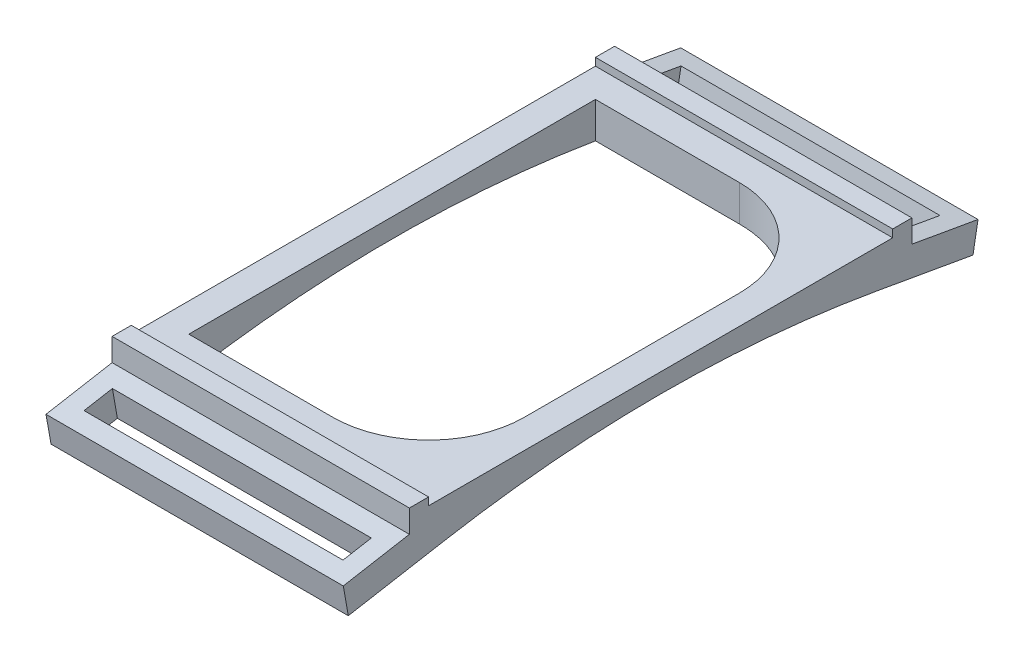
ISO-10303-21;
HEADER;
FILE_DESCRIPTION(('STEP AP214'),'2;1');
FILE_NAME('part.step','',(''),(''),'','','');
FILE_SCHEMA(('AUTOMOTIVE_DESIGN { 1 0 10303 214 1 1 1 1 }'));
ENDSEC;
DATA;
#1=APPLICATION_CONTEXT('core data for automotive mechanical design processes');
#2=APPLICATION_PROTOCOL_DEFINITION('international standard','automotive_design',2000,#1);
#3=PRODUCT_CONTEXT('',#1,'mechanical');
#4=PRODUCT('Part','Part','',(#3));
#5=PRODUCT_RELATED_PRODUCT_CATEGORY('part','',(#4));
#6=PRODUCT_DEFINITION_FORMATION('','',#4);
#7=PRODUCT_DEFINITION_CONTEXT('part definition',#1,'design');
#8=PRODUCT_DEFINITION('design','',#6,#7);
#9=PRODUCT_DEFINITION_SHAPE('','',#8);
#10=(LENGTH_UNIT() NAMED_UNIT(*) SI_UNIT(.MILLI.,.METRE.));
#11=(NAMED_UNIT(*) PLANE_ANGLE_UNIT() SI_UNIT($,.RADIAN.));
#12=(NAMED_UNIT(*) SI_UNIT($,.STERADIAN.) SOLID_ANGLE_UNIT());
#13=UNCERTAINTY_MEASURE_WITH_UNIT(LENGTH_MEASURE(1.E-05),#10,'distance_accuracy_value','');
#14=(GEOMETRIC_REPRESENTATION_CONTEXT(3) GLOBAL_UNCERTAINTY_ASSIGNED_CONTEXT((#13)) GLOBAL_UNIT_ASSIGNED_CONTEXT((#10,
#11,#12)) REPRESENTATION_CONTEXT('',''));
#15=CARTESIAN_POINT('',(0.,0.,0.));
#16=DIRECTION('',(0.,0.,1.));
#17=DIRECTION('',(1.,0.,0.));
#18=AXIS2_PLACEMENT_3D('',#15,#16,#17);
#19=CARTESIAN_POINT('',(31.,-1.57462492229734,26.2));
#20=DIRECTION('',(0.,-0.984807753012208,-0.173648177666928));
#21=DIRECTION('',(0.,0.173648177666928,-0.984807753012209));
#22=AXIS2_PLACEMENT_3D('',#19,#20,#21);
#23=PLANE('',#22);
#24=DIRECTION('',(0.,-0.173648177666928,0.984807753012208));
#25=VECTOR('',#24,1.);
#26=CARTESIAN_POINT('',(0.,-1.57462492229734,26.2));
#27=LINE('',#26,#25);
#28=CARTESIAN_POINT('',(0.,-1.57462492229734,26.2));
#29=VERTEX_POINT('',#28);
#30=CARTESIAN_POINT('',(0.,-2.79016216596584,33.0936542710855));
#31=VERTEX_POINT('',#30);
#32=EDGE_CURVE('E363',#29,#31,#27,.T.);
#33=ORIENTED_EDGE('',*,*,#32,.T.);
#34=DIRECTION('',(-1.,0.,0.));
#35=VECTOR('',#34,1.);
#36=CARTESIAN_POINT('',(31.,-2.79016216596584,33.0936542710855));
#37=LINE('',#36,#35);
#38=CARTESIAN_POINT('',(31.,-2.79016216596584,33.0936542710855));
#39=VERTEX_POINT('',#38);
#40=EDGE_CURVE('E373',#39,#31,#37,.T.);
#41=ORIENTED_EDGE('',*,*,#40,.F.);
#42=DIRECTION('',(0.,-0.173648177666928,0.984807753012208));
#43=VECTOR('',#42,1.);
#44=CARTESIAN_POINT('',(31.,-1.57462492229734,26.2));
#45=LINE('',#44,#43);
#46=CARTESIAN_POINT('',(31.,-1.57462492229734,26.2));
#47=VERTEX_POINT('',#46);
#48=EDGE_CURVE('E334',#47,#39,#45,.T.);
#49=ORIENTED_EDGE('',*,*,#48,.F.);
#50=DIRECTION('',(-1.,0.,0.));
#51=VECTOR('',#50,1.);
#52=CARTESIAN_POINT('',(31.,-1.57462492229734,26.2));
#53=LINE('',#52,#51);
#54=EDGE_CURVE('E376',#47,#29,#53,.T.);
#55=ORIENTED_EDGE('',*,*,#54,.T.);
#56=EDGE_LOOP('',(#33,#41,#49,#55));
#57=FACE_BOUND('',#56,.T.);
#58=DIRECTION('',(-1.,0.,0.));
#59=VECTOR('',#58,1.);
#60=CARTESIAN_POINT('',(29.,-2.44286581063198,31.124038765061));
#61=LINE('',#60,#59);
#62=CARTESIAN_POINT('',(29.,-2.44286581063198,31.124038765061));
#63=VERTEX_POINT('',#62);
#64=CARTESIAN_POINT('',(2.,-2.44286581063198,31.124038765061));
#65=VERTEX_POINT('',#64);
#66=EDGE_CURVE('E256',#63,#65,#61,.T.);
#67=ORIENTED_EDGE('',*,*,#66,.T.);
#68=DIRECTION('',(0.,0.173648177666928,-0.984807753012209));
#69=VECTOR('',#68,1.);
#70=CARTESIAN_POINT('',(2.,-2.44286581063198,31.124038765061));
#71=LINE('',#70,#69);
#72=CARTESIAN_POINT('',(2.,-1.92192127763119,28.1696155060244));
#73=VERTEX_POINT('',#72);
#74=EDGE_CURVE('E265',#65,#73,#71,.T.);
#75=ORIENTED_EDGE('',*,*,#74,.T.);
#76=DIRECTION('',(1.,0.,0.));
#77=VECTOR('',#76,1.);
#78=CARTESIAN_POINT('',(2.,-1.92192127763119,28.1696155060244));
#79=LINE('',#78,#77);
#80=CARTESIAN_POINT('',(29.,-1.92192127763119,28.1696155060244));
#81=VERTEX_POINT('',#80);
#82=EDGE_CURVE('E262',#73,#81,#79,.T.);
#83=ORIENTED_EDGE('',*,*,#82,.T.);
#84=DIRECTION('',(0.,-0.173648177666928,0.984807753012209));
#85=VECTOR('',#84,1.);
#86=CARTESIAN_POINT('',(29.,-1.92192127763119,28.1696155060244));
#87=LINE('',#86,#85);
#88=EDGE_CURVE('E259',#81,#63,#87,.T.);
#89=ORIENTED_EDGE('',*,*,#88,.T.);
#90=EDGE_LOOP('',(#67,#75,#83,#89));
#91=FACE_BOUND('',#90,.T.);
#92=ADVANCED_FACE('F33',(#57,#91),#23,.F.);
#93=CARTESIAN_POINT('',(31.,-5.74458542500246,32.5727097380847));
#94=DIRECTION('',(0.,0.984807753012209,0.173648177666928));
#95=DIRECTION('',(0.,-0.173648177666928,0.984807753012209));
#96=AXIS2_PLACEMENT_3D('',#93,#94,#95);
#97=PLANE('',#96);
#98=DIRECTION('',(0.,0.173648177666928,-0.984807753012208));
#99=VECTOR('',#98,1.);
#100=CARTESIAN_POINT('',(0.,-5.74458542500246,32.5727097380847));
#101=LINE('',#100,#99);
#102=CARTESIAN_POINT('',(0.,-5.74458542500246,32.5727097380847));
#103=VERTEX_POINT('',#102);
#104=CARTESIAN_POINT('',(0.,-3.96849492933327,22.5));
#105=VERTEX_POINT('',#104);
#106=EDGE_CURVE('E314',#103,#105,#101,.T.);
#107=ORIENTED_EDGE('',*,*,#106,.T.);
#108=DIRECTION('',(-1.,0.,0.));
#109=VECTOR('',#108,1.);
#110=CARTESIAN_POINT('',(31.,-3.96849492933327,22.5));
#111=LINE('',#110,#109);
#112=CARTESIAN_POINT('',(31.,-3.96849492933327,22.5));
#113=VERTEX_POINT('',#112);
#114=EDGE_CURVE('E340',#113,#105,#111,.T.);
#115=ORIENTED_EDGE('',*,*,#114,.F.);
#116=DIRECTION('',(0.,0.173648177666928,-0.984807753012208));
#117=VECTOR('',#116,1.);
#118=CARTESIAN_POINT('',(31.,-5.74458542500246,32.5727097380847));
#119=LINE('',#118,#117);
#120=CARTESIAN_POINT('',(31.,-5.74458542500246,32.5727097380847));
#121=VERTEX_POINT('',#120);
#122=EDGE_CURVE('E338',#121,#113,#119,.T.);
#123=ORIENTED_EDGE('',*,*,#122,.F.);
#124=DIRECTION('',(-1.,0.,0.));
#125=VECTOR('',#124,1.);
#126=CARTESIAN_POINT('',(31.,-5.74458542500246,32.5727097380847));
#127=LINE('',#126,#125);
#128=EDGE_CURVE('E370',#121,#103,#127,.T.);
#129=ORIENTED_EDGE('',*,*,#128,.T.);
#130=EDGE_LOOP('',(#107,#115,#123,#129));
#131=FACE_BOUND('',#130,.T.);
#132=DIRECTION('',(-1.,0.,0.));
#133=VECTOR('',#132,1.);
#134=CARTESIAN_POINT('',(31.,-5.39728906966861,30.6030942320603));
#135=LINE('',#134,#133);
#136=CARTESIAN_POINT('',(29.,-5.39728906966861,30.6030942320603));
#137=VERTEX_POINT('',#136);
#138=CARTESIAN_POINT('',(2.,-5.39728906966861,30.6030942320603));
#139=VERTEX_POINT('',#138);
#140=EDGE_CURVE('E416',#137,#139,#135,.T.);
#141=ORIENTED_EDGE('',*,*,#140,.F.);
#142=DIRECTION('',(0.,-0.173648177666928,0.984807753012209));
#143=VECTOR('',#142,1.);
#144=CARTESIAN_POINT('',(29.,-5.74458542500246,32.5727097380847));
#145=LINE('',#144,#143);
#146=CARTESIAN_POINT('',(29.,-4.87634453666783,27.6486709730236));
#147=VERTEX_POINT('',#146);
#148=EDGE_CURVE('E409',#147,#137,#145,.T.);
#149=ORIENTED_EDGE('',*,*,#148,.F.);
#150=DIRECTION('',(1.,0.,0.));
#151=VECTOR('',#150,1.);
#152=CARTESIAN_POINT('',(31.,-4.87634453666783,27.6486709730236));
#153=LINE('',#152,#151);
#154=CARTESIAN_POINT('',(2.,-4.87634453666782,27.6486709730236));
#155=VERTEX_POINT('',#154);
#156=EDGE_CURVE('E411',#155,#147,#153,.T.);
#157=ORIENTED_EDGE('',*,*,#156,.F.);
#158=DIRECTION('',(0.,0.173648177666928,-0.984807753012209));
#159=VECTOR('',#158,1.);
#160=CARTESIAN_POINT('',(2.,-5.74458542500246,32.5727097380847));
#161=LINE('',#160,#159);
#162=EDGE_CURVE('E414',#139,#155,#161,.T.);
#163=ORIENTED_EDGE('',*,*,#162,.F.);
#164=EDGE_LOOP('',(#141,#149,#157,#163));
#165=FACE_BOUND('',#164,.T.);
#166=ADVANCED_FACE('F449',(#131,#165),#97,.F.);
#167=CARTESIAN_POINT('',(31.,-131.572335870734,0.));
#168=DIRECTION('',(-1.,0.,0.));
#169=DIRECTION('',(0.,0.,1.));
#170=AXIS2_PLACEMENT_3D('',#167,#168,#169);
#171=CYLINDRICAL_SURFACE('',#170,129.572335870734);
#172=DIRECTION('',(-1.,0.,0.));
#173=VECTOR('',#172,1.);
#174=CARTESIAN_POINT('',(31.,-3.74608573799212,21.2));
#175=LINE('',#174,#173);
#176=CARTESIAN_POINT('',(3.,-3.74608573799212,21.2));
#177=VERTEX_POINT('',#176);
#178=CARTESIAN_POINT('',(18.,-3.74608573799212,21.2));
#179=VERTEX_POINT('',#178);
#180=EDGE_CURVE('E225',#177,#179,#175,.F.);
#181=ORIENTED_EDGE('',*,*,#180,.T.);
#182=CARTESIAN_POINT('',(18.,-3.74608573799212,21.2));
#183=CARTESIAN_POINT('',(18.2788804973499,-3.74609801660614,21.2000322510538));
#184=CARTESIAN_POINT('',(18.5577545775977,-3.74415134880994,21.188335235251));
#185=CARTESIAN_POINT('',(19.11347822453,-3.73642910817919,21.1417169711941));
#186=CARTESIAN_POINT('',(19.3903279636504,-3.73065386540099,21.1067977248966));
#187=CARTESIAN_POINT('',(19.9397028904055,-3.71537281126086,21.0140261552654));
#188=CARTESIAN_POINT('',(20.2122329657765,-3.70587158427231,20.9562020127606));
#189=CARTESIAN_POINT('',(20.7513815804246,-3.68330981006005,20.8180729578506));
#190=CARTESIAN_POINT('',(21.0180001458344,-3.67024927857416,20.7377681448458));
#191=CARTESIAN_POINT('',(21.5435232921134,-3.64079108850996,20.5552572926332));
#192=CARTESIAN_POINT('',(21.8024257368055,-3.62439251546805,20.4530452514865));
#193=CARTESIAN_POINT('',(22.3106450878467,-3.5885408799423,20.2274930828801));
#194=CARTESIAN_POINT('',(22.5599617087517,-3.56908772658754,20.1041523268508));
#195=CARTESIAN_POINT('',(23.0472729468978,-3.52745433907865,19.8372570313338));
#196=CARTESIAN_POINT('',(23.2852681294538,-3.50527424128808,19.6937035025539));
#197=CARTESIAN_POINT('',(23.7483298355887,-3.45854914264167,19.3874150434493));
#198=CARTESIAN_POINT('',(23.9733963430065,-3.43400413882974,19.2246800891482));
#199=CARTESIAN_POINT('',(24.4106835297211,-3.38275244589328,18.8799233709124));
#200=CARTESIAN_POINT('',(24.6227978822385,-3.3560312221023,18.6977689004807));
#201=CARTESIAN_POINT('',(25.0309309739883,-3.3010038856932,18.3164600672298));
#202=CARTESIAN_POINT('',(25.2269495608194,-3.27269775807284,18.1173055434834));
#203=CARTESIAN_POINT('',(25.6016084646355,-3.21492289959873,17.7033452190375));
#204=CARTESIAN_POINT('',(25.7802448397136,-3.18545390715239,17.4885358873962));
#205=CARTESIAN_POINT('',(26.118881333368,-3.12578980200644,17.0447978231884));
#206=CARTESIAN_POINT('',(26.2788816019693,-3.09559469515459,16.8158692043083));
#207=CARTESIAN_POINT('',(26.5808008892667,-3.03456982701616,16.3429000302417));
#208=CARTESIAN_POINT('',(26.7225040450756,-3.00373673522613,16.0987220630322));
#209=CARTESIAN_POINT('',(26.9847699835916,-2.94218130232455,15.5992587109619));
#210=CARTESIAN_POINT('',(27.10533294818,-2.91145896026238,15.3439734216875));
#211=CARTESIAN_POINT('',(27.3244205537302,-2.85053368979728,14.8241786041416));
#212=CARTESIAN_POINT('',(27.4229550384899,-2.82033053497918,14.5596732573359));
#213=CARTESIAN_POINT('',(27.5973201347922,-2.76080603142132,14.0232978982243));
#214=CARTESIAN_POINT('',(27.6731559274923,-2.73148448282457,13.7514295820485));
#215=CARTESIAN_POINT('',(27.8245167875709,-2.66378045575342,13.1039924345509));
#216=CARTESIAN_POINT('',(27.8902856544822,-2.62589588448009,12.7260188042396));
#217=CARTESIAN_POINT('',(27.956083231741,-2.57129196051778,12.1555544907636));
#218=CARTESIAN_POINT('',(27.9725397750926,-2.55346910507223,11.9649074150755));
#219=CARTESIAN_POINT('',(27.9944982401877,-2.51860999417502,11.5828699518911));
#220=CARTESIAN_POINT('',(27.9999977842006,-2.50157391024053,11.3914794120855));
#221=CARTESIAN_POINT('',(28.,-2.48496149586225,11.2));
#222=B_SPLINE_CURVE_WITH_KNOTS('',3,(#182,#183,#184,#185,#186,#187,#188,#189,#190,#191,#192,
#193,#194,#195,#196,#197,#198,#199,#200,#201,#202,#203,#204,#205,#206,#207,#208,#209,#210,#211,
#212,#213,#214,#215,#216,#217,#218,#219,#220,#221),.UNSPECIFIED.,.F.,.F.,(4,2,2,2,2,2,2,2,2,2,2,
2,2,2,2,2,2,2,2,4),(0.,0.83638006800441,1.6726880421739,2.50797025260984,3.34324876982243,
4.17875642207096,5.01428893460922,5.84977968249713,6.68527147474697,7.52689126563336,
8.3685190244071,9.21033720335049,10.0521486049901,10.9031266812263,11.7540974356439,
12.6046871559171,13.4550825739832,14.6087578625394,15.1850465831071,15.7614603479516),.UNSPECIFIED.);
#223=CARTESIAN_POINT('',(28.,-2.48496149586228,11.2));
#224=VERTEX_POINT('',#223);
#225=EDGE_CURVE('E11',#179,#224,#222,.T.);
#226=ORIENTED_EDGE('',*,*,#225,.T.);
#227=CARTESIAN_POINT('',(28.,-131.572335870734,0.));
#228=DIRECTION('',(1.,0.,0.));
#229=DIRECTION('',(0.,0.,-1.));
#230=AXIS2_PLACEMENT_3D('',#227,#228,#229);
#231=CIRCLE('',#230,129.572335870734);
#232=CARTESIAN_POINT('',(28.,-2.48496149586228,-11.2));
#233=VERTEX_POINT('',#232);
#234=EDGE_CURVE('E251',#224,#233,#231,.F.);
#235=ORIENTED_EDGE('',*,*,#234,.T.);
#236=CARTESIAN_POINT('',(28.,-2.48496149586228,-11.2));
#237=CARTESIAN_POINT('',(28.0000299376822,-2.50948865428279,-11.4828003153817));
#238=CARTESIAN_POINT('',(27.988004948193,-2.53496280820441,-11.765510133813));
#239=CARTESIAN_POINT('',(27.9401049611491,-2.58756126780461,-12.3287258200928));
#240=CARTESIAN_POINT('',(27.9042318596959,-2.6146854421386,-12.609231861364));
#241=CARTESIAN_POINT('',(27.8089368678891,-2.67031988069823,-13.165820538406));
#242=CARTESIAN_POINT('',(27.7495354817048,-2.69882891912848,-13.4419068084864));
#243=CARTESIAN_POINT('',(27.6076450345503,-2.75695426474626,-13.9879602336134));
#244=CARTESIAN_POINT('',(27.5251560394508,-2.78657056877447,-14.257927406116));
#245=CARTESIAN_POINT('',(27.3376626863014,-2.8465818132651,-14.7899346358994));
#246=CARTESIAN_POINT('',(27.2326511651337,-2.87697699873046,-15.0519721408843));
#247=CARTESIAN_POINT('',(27.0008779955424,-2.93816243164377,-15.5662037118702));
#248=CARTESIAN_POINT('',(26.8741158453053,-2.96895268819132,-15.818397550601));
#249=CARTESIAN_POINT('',(26.5997495318613,-3.03052021293766,-16.3111465693224));
#250=CARTESIAN_POINT('',(26.4521476257885,-3.06129748218149,-16.5517030059654));
#251=CARTESIAN_POINT('',(26.1371182654744,-3.12241657021698,-17.0195215101288));
#252=CARTESIAN_POINT('',(25.9696908699325,-3.15275839029763,-17.2467836170082));
#253=CARTESIAN_POINT('',(25.6156980590623,-3.21264651768636,-17.6869968376417));
#254=CARTESIAN_POINT('',(25.4290831891459,-3.24219050828451,-17.8999085039137));
#255=CARTESIAN_POINT('',(25.038378327424,-3.29995099910096,-18.3092390898581));
#256=CARTESIAN_POINT('',(24.8342884113702,-3.32816750507289,-18.5056580810163));
#257=CARTESIAN_POINT('',(24.4100098268774,-3.38283441150323,-18.8806211162662));
#258=CARTESIAN_POINT('',(24.1898181465577,-3.40928447976503,-19.0591618012955));
#259=CARTESIAN_POINT('',(23.73491309776,-3.4599818350061,-19.3970141055277));
#260=CARTESIAN_POINT('',(23.5002000461404,-3.48422917002087,-19.5563261440789));
#261=CARTESIAN_POINT('',(23.0190077652635,-3.53000997848442,-19.8538551813933));
#262=CARTESIAN_POINT('',(22.7725873679959,-3.55155537628188,-19.9921654811048));
#263=CARTESIAN_POINT('',(22.2687422241833,-3.59169323060551,-20.2475194714213));
#264=CARTESIAN_POINT('',(22.0113177958808,-3.61028577245665,-20.3645637765371));
#265=CARTESIAN_POINT('',(21.487438318254,-3.64418399863791,-20.5764355705665));
#266=CARTESIAN_POINT('',(21.2209886524906,-3.65949160380799,-20.6712760459567));
#267=CARTESIAN_POINT('',(20.6809571722279,-3.68655770835504,-20.83806814642));
#268=CARTESIAN_POINT('',(20.4073772828359,-3.69831715514215,-20.9100258817965));
#269=CARTESIAN_POINT('',(19.7813241645782,-3.72070979279947,-21.0465684454311));
#270=CARTESIAN_POINT('',(19.4272287937087,-3.7302106762805,-21.1040964836402));
#271=CARTESIAN_POINT('',(18.8933245877431,-3.73972647162952,-21.1616282678408));
#272=CARTESIAN_POINT('',(18.7149806413559,-3.74210913936275,-21.1760121360083));
#273=CARTESIAN_POINT('',(18.3577716870139,-3.74528906741285,-21.1951972025367));
#274=CARTESIAN_POINT('',(18.1789067019345,-3.74608639631183,-21.1999988154281));
#275=CARTESIAN_POINT('',(18.,-3.74608573799212,-21.2));
#276=B_SPLINE_CURVE_WITH_KNOTS('',3,(#236,#237,#238,#239,#240,#241,#242,#243,#244,#245,#246,
#247,#248,#249,#250,#251,#252,#253,#254,#255,#256,#257,#258,#259,#260,#261,#262,#263,#264,#265,
#266,#267,#268,#269,#270,#271,#272,#273,#274,#275),.UNSPECIFIED.,.F.,.F.,(4,2,2,2,2,2,2,2,2,2,2,
2,2,2,2,2,2,2,2,4),(0.,0.851317731150147,1.70256778433073,2.55307762597183,3.40358504107092,
4.25436335575657,5.10516130157429,5.95586716886507,6.80657051744597,7.65952424913801,
8.51247428359304,9.36558427490766,10.2186756577964,11.0678586891584,11.9170171782793,
12.7656777676667,13.6141115513316,14.6883059304664,15.224899885502,15.7614706268589),.UNSPECIFIED.);
#277=CARTESIAN_POINT('',(18.,-3.74608573799212,-21.2));
#278=VERTEX_POINT('',#277);
#279=EDGE_CURVE('E429',#233,#278,#276,.T.);
#280=ORIENTED_EDGE('',*,*,#279,.T.);
#281=DIRECTION('',(-1.,0.,0.));
#282=VECTOR('',#281,1.);
#283=CARTESIAN_POINT('',(31.,-3.74608573799212,-21.2));
#284=LINE('',#283,#282);
#285=CARTESIAN_POINT('',(3.,-3.74608573799212,-21.2));
#286=VERTEX_POINT('',#285);
#287=EDGE_CURVE('E254',#278,#286,#284,.T.);
#288=ORIENTED_EDGE('',*,*,#287,.T.);
#289=CARTESIAN_POINT('',(3.,-131.572335870734,0.));
#290=DIRECTION('',(-1.,0.,0.));
#291=DIRECTION('',(0.,0.,1.));
#292=AXIS2_PLACEMENT_3D('',#289,#290,#291);
#293=CIRCLE('',#292,129.572335870734);
#294=EDGE_CURVE('E229',#286,#177,#293,.F.);
#295=ORIENTED_EDGE('',*,*,#294,.T.);
#296=EDGE_LOOP('',(#181,#226,#235,#280,#288,#295));
#297=FACE_BOUND('',#296,.T.);
#298=CARTESIAN_POINT('',(0.,-131.572335870734,0.));
#299=DIRECTION('',(-1.,0.,0.));
#300=DIRECTION('',(0.,0.,-1.));
#301=AXIS2_PLACEMENT_3D('',#298,#299,#300);
#302=CIRCLE('',#301,129.572335870734);
#303=CARTESIAN_POINT('',(0.,-3.96849492933326,-22.5));
#304=VERTEX_POINT('',#303);
#305=EDGE_CURVE('E309',#105,#304,#302,.T.);
#306=ORIENTED_EDGE('',*,*,#305,.T.);
#307=DIRECTION('',(-1.,0.,0.));
#308=VECTOR('',#307,1.);
#309=CARTESIAN_POINT('',(31.,-3.96849492933326,-22.5));
#310=LINE('',#309,#308);
#311=CARTESIAN_POINT('',(31.,-3.96849492933326,-22.5));
#312=VERTEX_POINT('',#311);
#313=EDGE_CURVE('E406',#312,#304,#310,.T.);
#314=ORIENTED_EDGE('',*,*,#313,.F.);
#315=CARTESIAN_POINT('',(31.,-131.572335870734,0.));
#316=DIRECTION('',(-1.,0.,0.));
#317=DIRECTION('',(0.,0.,-1.));
#318=AXIS2_PLACEMENT_3D('',#315,#316,#317);
#319=CIRCLE('',#318,129.572335870734);
#320=EDGE_CURVE('E310',#113,#312,#319,.T.);
#321=ORIENTED_EDGE('',*,*,#320,.F.);
#322=ORIENTED_EDGE('',*,*,#114,.T.);
#323=EDGE_LOOP('',(#306,#314,#321,#322));
#324=FACE_BOUND('',#323,.T.);
#325=ADVANCED_FACE('F434',(#297,#324),#171,.F.);
#326=CARTESIAN_POINT('',(31.,-5.74458542500246,-32.5727097380847));
#327=DIRECTION('',(0.,0.984807753012209,-0.173648177666927));
#328=DIRECTION('',(0.,0.173648177666927,0.984807753012209));
#329=AXIS2_PLACEMENT_3D('',#326,#327,#328);
#330=PLANE('',#329);
#331=DIRECTION('',(0.,-0.173648177666927,-0.984807753012209));
#332=VECTOR('',#331,1.);
#333=CARTESIAN_POINT('',(29.,-5.74458542500246,-32.5727097380847));
#334=LINE('',#333,#332);
#335=CARTESIAN_POINT('',(29.,-4.87634453666782,-27.6486709730236));
#336=VERTEX_POINT('',#335);
#337=CARTESIAN_POINT('',(29.,-5.3972890696686,-30.6030942320603));
#338=VERTEX_POINT('',#337);
#339=EDGE_CURVE('E303',#336,#338,#334,.T.);
#340=ORIENTED_EDGE('',*,*,#339,.T.);
#341=DIRECTION('',(-1.,0.,0.));
#342=VECTOR('',#341,1.);
#343=CARTESIAN_POINT('',(31.,-5.3972890696686,-30.6030942320603));
#344=LINE('',#343,#342);
#345=CARTESIAN_POINT('',(2.,-5.3972890696686,-30.6030942320603));
#346=VERTEX_POINT('',#345);
#347=EDGE_CURVE('E306',#338,#346,#344,.T.);
#348=ORIENTED_EDGE('',*,*,#347,.T.);
#349=DIRECTION('',(0.,0.173648177666927,0.984807753012209));
#350=VECTOR('',#349,1.);
#351=CARTESIAN_POINT('',(2.,-5.74458542500246,-32.5727097380847));
#352=LINE('',#351,#350);
#353=CARTESIAN_POINT('',(2.,-4.87634453666782,-27.6486709730236));
#354=VERTEX_POINT('',#353);
#355=EDGE_CURVE('E291',#346,#354,#352,.T.);
#356=ORIENTED_EDGE('',*,*,#355,.T.);
#357=DIRECTION('',(1.,0.,0.));
#358=VECTOR('',#357,1.);
#359=CARTESIAN_POINT('',(31.,-4.87634453666782,-27.6486709730236));
#360=LINE('',#359,#358);
#361=EDGE_CURVE('E300',#354,#336,#360,.T.);
#362=ORIENTED_EDGE('',*,*,#361,.T.);
#363=EDGE_LOOP('',(#340,#348,#356,#362));
#364=FACE_BOUND('',#363,.T.);
#365=DIRECTION('',(0.,-0.173648177666927,-0.984807753012208));
#366=VECTOR('',#365,1.);
#367=CARTESIAN_POINT('',(0.,-5.74458542500246,-32.5727097380847));
#368=LINE('',#367,#366);
#369=CARTESIAN_POINT('',(0.,-5.74458542500246,-32.5727097380847));
#370=VERTEX_POINT('',#369);
#371=EDGE_CURVE('E343',#304,#370,#368,.T.);
#372=ORIENTED_EDGE('',*,*,#371,.T.);
#373=DIRECTION('',(-1.,0.,0.));
#374=VECTOR('',#373,1.);
#375=CARTESIAN_POINT('',(31.,-5.74458542500246,-32.5727097380847));
#376=LINE('',#375,#374);
#377=CARTESIAN_POINT('',(31.,-5.74458542500246,-32.5727097380847));
#378=VERTEX_POINT('',#377);
#379=EDGE_CURVE('E403',#378,#370,#376,.T.);
#380=ORIENTED_EDGE('',*,*,#379,.F.);
#381=DIRECTION('',(0.,-0.173648177666927,-0.984807753012208));
#382=VECTOR('',#381,1.);
#383=CARTESIAN_POINT('',(31.,-5.74458542500246,-32.5727097380847));
#384=LINE('',#383,#382);
#385=EDGE_CURVE('E313',#312,#378,#384,.T.);
#386=ORIENTED_EDGE('',*,*,#385,.F.);
#387=ORIENTED_EDGE('',*,*,#313,.T.);
#388=EDGE_LOOP('',(#372,#380,#386,#387));
#389=FACE_BOUND('',#388,.T.);
#390=ADVANCED_FACE('F493',(#364,#389),#330,.F.);
#391=CARTESIAN_POINT('',(31.,-2.79016216596583,-33.0936542710855));
#392=DIRECTION('',(0.,0.173648177666928,0.984807753012208));
#393=DIRECTION('',(0.,-0.984807753012208,0.173648177666928));
#394=AXIS2_PLACEMENT_3D('',#391,#392,#393);
#395=PLANE('',#394);
#396=DIRECTION('',(0.,0.984807753012208,-0.173648177666928));
#397=VECTOR('',#396,1.);
#398=CARTESIAN_POINT('',(0.,-2.79016216596583,-33.0936542710855));
#399=LINE('',#398,#397);
#400=CARTESIAN_POINT('',(0.,-2.79016216596583,-33.0936542710855));
#401=VERTEX_POINT('',#400);
#402=EDGE_CURVE('E345',#370,#401,#399,.T.);
#403=ORIENTED_EDGE('',*,*,#402,.T.);
#404=DIRECTION('',(-1.,0.,0.));
#405=VECTOR('',#404,1.);
#406=CARTESIAN_POINT('',(31.,-2.79016216596583,-33.0936542710855));
#407=LINE('',#406,#405);
#408=CARTESIAN_POINT('',(31.,-2.79016216596583,-33.0936542710855));
#409=VERTEX_POINT('',#408);
#410=EDGE_CURVE('E400',#409,#401,#407,.T.);
#411=ORIENTED_EDGE('',*,*,#410,.F.);
#412=DIRECTION('',(0.,0.984807753012208,-0.173648177666928));
#413=VECTOR('',#412,1.);
#414=CARTESIAN_POINT('',(31.,-2.79016216596583,-33.0936542710855));
#415=LINE('',#414,#413);
#416=EDGE_CURVE('E316',#378,#409,#415,.T.);
#417=ORIENTED_EDGE('',*,*,#416,.F.);
#418=ORIENTED_EDGE('',*,*,#379,.T.);
#419=EDGE_LOOP('',(#403,#411,#417,#418));
#420=FACE_BOUND('',#419,.T.);
#421=ADVANCED_FACE('F490',(#420),#395,.F.);
#422=CARTESIAN_POINT('',(31.,-1.57462492229734,-26.2));
#423=DIRECTION('',(0.,-0.984807753012209,0.173648177666928));
#424=DIRECTION('',(0.,-0.173648177666928,-0.984807753012209));
#425=AXIS2_PLACEMENT_3D('',#422,#423,#424);
#426=PLANE('',#425);
#427=DIRECTION('',(0.,0.173648177666928,0.984807753012209));
#428=VECTOR('',#427,1.);
#429=CARTESIAN_POINT('',(2.,-2.44286581063198,-31.124038765061));
#430=LINE('',#429,#428);
#431=CARTESIAN_POINT('',(2.,-2.44286581063198,-31.124038765061));
#432=VERTEX_POINT('',#431);
#433=CARTESIAN_POINT('',(2.,-1.92192127763119,-28.1696155060244));
#434=VERTEX_POINT('',#433);
#435=EDGE_CURVE('E279',#432,#434,#430,.T.);
#436=ORIENTED_EDGE('',*,*,#435,.F.);
#437=DIRECTION('',(-1.,0.,0.));
#438=VECTOR('',#437,1.);
#439=CARTESIAN_POINT('',(29.,-2.44286581063198,-31.124038765061));
#440=LINE('',#439,#438);
#441=CARTESIAN_POINT('',(29.,-2.44286581063198,-31.124038765061));
#442=VERTEX_POINT('',#441);
#443=EDGE_CURVE('E271',#442,#432,#440,.T.);
#444=ORIENTED_EDGE('',*,*,#443,.F.);
#445=DIRECTION('',(0.,-0.173648177666928,-0.984807753012209));
#446=VECTOR('',#445,1.);
#447=CARTESIAN_POINT('',(29.,-1.92192127763119,-28.1696155060244));
#448=LINE('',#447,#446);
#449=CARTESIAN_POINT('',(29.,-1.92192127763119,-28.1696155060244));
#450=VERTEX_POINT('',#449);
#451=EDGE_CURVE('E285',#450,#442,#448,.T.);
#452=ORIENTED_EDGE('',*,*,#451,.F.);
#453=DIRECTION('',(1.,0.,0.));
#454=VECTOR('',#453,1.);
#455=CARTESIAN_POINT('',(2.,-1.92192127763119,-28.1696155060244));
#456=LINE('',#455,#454);
#457=EDGE_CURVE('E282',#434,#450,#456,.T.);
#458=ORIENTED_EDGE('',*,*,#457,.F.);
#459=EDGE_LOOP('',(#436,#444,#452,#458));
#460=FACE_BOUND('',#459,.T.);
#461=DIRECTION('',(0.,0.173648177666928,0.984807753012208));
#462=VECTOR('',#461,1.);
#463=CARTESIAN_POINT('',(0.,-1.57462492229734,-26.2));
#464=LINE('',#463,#462);
#465=CARTESIAN_POINT('',(0.,-1.57462492229734,-26.2));
#466=VERTEX_POINT('',#465);
#467=EDGE_CURVE('E347',#401,#466,#464,.T.);
#468=ORIENTED_EDGE('',*,*,#467,.T.);
#469=DIRECTION('',(-1.,0.,0.));
#470=VECTOR('',#469,1.);
#471=CARTESIAN_POINT('',(31.,-1.57462492229734,-26.2));
#472=LINE('',#471,#470);
#473=CARTESIAN_POINT('',(31.,-1.57462492229734,-26.2));
#474=VERTEX_POINT('',#473);
#475=EDGE_CURVE('E397',#474,#466,#472,.T.);
#476=ORIENTED_EDGE('',*,*,#475,.F.);
#477=DIRECTION('',(0.,0.173648177666928,0.984807753012208));
#478=VECTOR('',#477,1.);
#479=CARTESIAN_POINT('',(31.,-1.57462492229734,-26.2));
#480=LINE('',#479,#478);
#481=EDGE_CURVE('E318',#409,#474,#480,.T.);
#482=ORIENTED_EDGE('',*,*,#481,.F.);
#483=ORIENTED_EDGE('',*,*,#410,.T.);
#484=EDGE_LOOP('',(#468,#476,#482,#483));
#485=FACE_BOUND('',#484,.T.);
#486=ADVANCED_FACE('F486',(#460,#485),#426,.F.);
#487=CARTESIAN_POINT('',(31.,0.800000000000002,-26.2));
#488=DIRECTION('',(0.,0.,1.));
#489=DIRECTION('',(1.,0.,0.));
#490=AXIS2_PLACEMENT_3D('',#487,#488,#489);
#491=PLANE('',#490);
#492=DIRECTION('',(0.,1.,0.));
#493=VECTOR('',#492,1.);
#494=CARTESIAN_POINT('',(0.,0.800000000000002,-26.2));
#495=LINE('',#494,#493);
#496=CARTESIAN_POINT('',(0.,0.800000000000002,-26.2));
#497=VERTEX_POINT('',#496);
#498=EDGE_CURVE('E349',#466,#497,#495,.T.);
#499=ORIENTED_EDGE('',*,*,#498,.T.);
#500=DIRECTION('',(-1.,0.,0.));
#501=VECTOR('',#500,1.);
#502=CARTESIAN_POINT('',(31.,0.800000000000002,-26.2));
#503=LINE('',#502,#501);
#504=CARTESIAN_POINT('',(31.,0.800000000000002,-26.2));
#505=VERTEX_POINT('',#504);
#506=EDGE_CURVE('E394',#505,#497,#503,.T.);
#507=ORIENTED_EDGE('',*,*,#506,.F.);
#508=DIRECTION('',(0.,1.,0.));
#509=VECTOR('',#508,1.);
#510=CARTESIAN_POINT('',(31.,0.800000000000002,-26.2));
#511=LINE('',#510,#509);
#512=EDGE_CURVE('E320',#474,#505,#511,.T.);
#513=ORIENTED_EDGE('',*,*,#512,.F.);
#514=ORIENTED_EDGE('',*,*,#475,.T.);
#515=EDGE_LOOP('',(#499,#507,#513,#514));
#516=FACE_BOUND('',#515,.T.);
#517=ADVANCED_FACE('F482',(#516),#491,.F.);
#518=CARTESIAN_POINT('',(31.,0.800000000000002,-24.2));
#519=DIRECTION('',(0.,-1.,0.));
#520=DIRECTION('',(0.,0.,-1.));
#521=AXIS2_PLACEMENT_3D('',#518,#519,#520);
#522=PLANE('',#521);
#523=DIRECTION('',(0.,0.,1.));
#524=VECTOR('',#523,1.);
#525=CARTESIAN_POINT('',(0.,0.800000000000002,-24.2));
#526=LINE('',#525,#524);
#527=CARTESIAN_POINT('',(0.,0.800000000000002,-24.2));
#528=VERTEX_POINT('',#527);
#529=EDGE_CURVE('E351',#497,#528,#526,.T.);
#530=ORIENTED_EDGE('',*,*,#529,.T.);
#531=DIRECTION('',(-1.,0.,0.));
#532=VECTOR('',#531,1.);
#533=CARTESIAN_POINT('',(31.,0.800000000000002,-24.2));
#534=LINE('',#533,#532);
#535=CARTESIAN_POINT('',(31.,0.800000000000002,-24.2));
#536=VERTEX_POINT('',#535);
#537=EDGE_CURVE('E391',#536,#528,#534,.T.);
#538=ORIENTED_EDGE('',*,*,#537,.F.);
#539=DIRECTION('',(0.,0.,1.));
#540=VECTOR('',#539,1.);
#541=CARTESIAN_POINT('',(31.,0.800000000000002,-24.2));
#542=LINE('',#541,#540);
#543=EDGE_CURVE('E322',#505,#536,#542,.T.);
#544=ORIENTED_EDGE('',*,*,#543,.F.);
#545=ORIENTED_EDGE('',*,*,#506,.T.);
#546=EDGE_LOOP('',(#530,#538,#544,#545));
#547=FACE_BOUND('',#546,.T.);
#548=ADVANCED_FACE('F478',(#547),#522,.F.);
#549=CARTESIAN_POINT('',(31.,0.,-24.2));
#550=DIRECTION('',(0.,0.,-1.));
#551=DIRECTION('',(-1.,0.,0.));
#552=AXIS2_PLACEMENT_3D('',#549,#550,#551);
#553=PLANE('',#552);
#554=DIRECTION('',(0.,-1.,0.));
#555=VECTOR('',#554,1.);
#556=CARTESIAN_POINT('',(0.,0.,-24.2));
#557=LINE('',#556,#555);
#558=CARTESIAN_POINT('',(0.,0.,-24.2));
#559=VERTEX_POINT('',#558);
#560=EDGE_CURVE('E353',#528,#559,#557,.T.);
#561=ORIENTED_EDGE('',*,*,#560,.T.);
#562=DIRECTION('',(-1.,0.,0.));
#563=VECTOR('',#562,1.);
#564=CARTESIAN_POINT('',(31.,0.,-24.2));
#565=LINE('',#564,#563);
#566=CARTESIAN_POINT('',(31.,0.,-24.2));
#567=VERTEX_POINT('',#566);
#568=EDGE_CURVE('E388',#567,#559,#565,.T.);
#569=ORIENTED_EDGE('',*,*,#568,.F.);
#570=DIRECTION('',(0.,-1.,0.));
#571=VECTOR('',#570,1.);
#572=CARTESIAN_POINT('',(31.,0.,-24.2));
#573=LINE('',#572,#571);
#574=EDGE_CURVE('E324',#536,#567,#573,.T.);
#575=ORIENTED_EDGE('',*,*,#574,.F.);
#576=ORIENTED_EDGE('',*,*,#537,.T.);
#577=EDGE_LOOP('',(#561,#569,#575,#576));
#578=FACE_BOUND('',#577,.T.);
#579=ADVANCED_FACE('F475',(#578),#553,.F.);
#580=CARTESIAN_POINT('',(31.,0.,24.2));
#581=DIRECTION('',(0.,-1.,0.));
#582=DIRECTION('',(0.,0.,-1.));
#583=AXIS2_PLACEMENT_3D('',#580,#581,#582);
#584=PLANE('',#583);
#585=DIRECTION('',(0.,0.,1.));
#586=VECTOR('',#585,1.);
#587=CARTESIAN_POINT('',(3.,0.,-21.2));
#588=LINE('',#587,#586);
#589=CARTESIAN_POINT('',(3.,0.,-21.2));
#590=VERTEX_POINT('',#589);
#591=CARTESIAN_POINT('',(3.,0.,21.2));
#592=VERTEX_POINT('',#591);
#593=EDGE_CURVE('E234',#590,#592,#588,.T.);
#594=ORIENTED_EDGE('',*,*,#593,.F.);
#595=DIRECTION('',(-1.,0.,0.));
#596=VECTOR('',#595,1.);
#597=CARTESIAN_POINT('',(28.,0.,-21.2));
#598=LINE('',#597,#596);
#599=CARTESIAN_POINT('',(18.,0.,-21.2));
#600=VERTEX_POINT('',#599);
#601=EDGE_CURVE('E238',#600,#590,#598,.T.);
#602=ORIENTED_EDGE('',*,*,#601,.F.);
#603=CARTESIAN_POINT('',(18.,0.,-11.2));
#604=DIRECTION('',(0.,-1.,0.));
#605=DIRECTION('',(0.,0.,-1.));
#606=AXIS2_PLACEMENT_3D('',#603,#604,#605);
#607=CIRCLE('',#606,10.);
#608=CARTESIAN_POINT('',(28.,0.,-11.2));
#609=VERTEX_POINT('',#608);
#610=EDGE_CURVE('E427',#600,#609,#607,.T.);
#611=ORIENTED_EDGE('',*,*,#610,.T.);
#612=DIRECTION('',(0.,0.,-1.));
#613=VECTOR('',#612,1.);
#614=CARTESIAN_POINT('',(28.,0.,21.2));
#615=LINE('',#614,#613);
#616=CARTESIAN_POINT('',(28.,0.,11.2));
#617=VERTEX_POINT('',#616);
#618=EDGE_CURVE('E242',#617,#609,#615,.T.);
#619=ORIENTED_EDGE('',*,*,#618,.F.);
#620=CARTESIAN_POINT('',(18.,0.,11.2));
#621=DIRECTION('',(0.,-1.,0.));
#622=DIRECTION('',(0.,0.,-1.));
#623=AXIS2_PLACEMENT_3D('',#620,#621,#622);
#624=CIRCLE('',#623,10.);
#625=CARTESIAN_POINT('',(18.,0.,21.2));
#626=VERTEX_POINT('',#625);
#627=EDGE_CURVE('E47',#617,#626,#624,.T.);
#628=ORIENTED_EDGE('',*,*,#627,.T.);
#629=DIRECTION('',(1.,0.,0.));
#630=VECTOR('',#629,1.);
#631=CARTESIAN_POINT('',(3.,0.,21.2));
#632=LINE('',#631,#630);
#633=EDGE_CURVE('E224',#592,#626,#632,.T.);
#634=ORIENTED_EDGE('',*,*,#633,.F.);
#635=EDGE_LOOP('',(#594,#602,#611,#619,#628,#634));
#636=FACE_BOUND('',#635,.T.);
#637=DIRECTION('',(0.,0.,1.));
#638=VECTOR('',#637,1.);
#639=CARTESIAN_POINT('',(0.,0.,24.2));
#640=LINE('',#639,#638);
#641=CARTESIAN_POINT('',(0.,0.,24.2));
#642=VERTEX_POINT('',#641);
#643=EDGE_CURVE('E355',#559,#642,#640,.T.);
#644=ORIENTED_EDGE('',*,*,#643,.T.);
#645=DIRECTION('',(-1.,0.,0.));
#646=VECTOR('',#645,1.);
#647=CARTESIAN_POINT('',(31.,0.,24.2));
#648=LINE('',#647,#646);
#649=CARTESIAN_POINT('',(31.,0.,24.2));
#650=VERTEX_POINT('',#649);
#651=EDGE_CURVE('E385',#650,#642,#648,.T.);
#652=ORIENTED_EDGE('',*,*,#651,.F.);
#653=DIRECTION('',(0.,0.,1.));
#654=VECTOR('',#653,1.);
#655=CARTESIAN_POINT('',(31.,0.,24.2));
#656=LINE('',#655,#654);
#657=EDGE_CURVE('E326',#567,#650,#656,.T.);
#658=ORIENTED_EDGE('',*,*,#657,.F.);
#659=ORIENTED_EDGE('',*,*,#568,.T.);
#660=EDGE_LOOP('',(#644,#652,#658,#659));
#661=FACE_BOUND('',#660,.T.);
#662=ADVANCED_FACE('F240',(#636,#661),#584,.F.);
#663=CARTESIAN_POINT('',(31.,0.,24.2));
#664=DIRECTION('',(0.,0.,1.));
#665=DIRECTION('',(1.,0.,0.));
#666=AXIS2_PLACEMENT_3D('',#663,#664,#665);
#667=PLANE('',#666);
#668=DIRECTION('',(0.,1.,0.));
#669=VECTOR('',#668,1.);
#670=CARTESIAN_POINT('',(0.,0.,24.2));
#671=LINE('',#670,#669);
#672=CARTESIAN_POINT('',(0.,0.800000000000001,24.2));
#673=VERTEX_POINT('',#672);
#674=EDGE_CURVE('E357',#642,#673,#671,.T.);
#675=ORIENTED_EDGE('',*,*,#674,.T.);
#676=DIRECTION('',(-1.,0.,0.));
#677=VECTOR('',#676,1.);
#678=CARTESIAN_POINT('',(31.,0.800000000000001,24.2));
#679=LINE('',#678,#677);
#680=CARTESIAN_POINT('',(31.,0.800000000000001,24.2));
#681=VERTEX_POINT('',#680);
#682=EDGE_CURVE('E382',#681,#673,#679,.T.);
#683=ORIENTED_EDGE('',*,*,#682,.F.);
#684=DIRECTION('',(0.,1.,0.));
#685=VECTOR('',#684,1.);
#686=CARTESIAN_POINT('',(31.,0.,24.2));
#687=LINE('',#686,#685);
#688=EDGE_CURVE('E328',#650,#681,#687,.T.);
#689=ORIENTED_EDGE('',*,*,#688,.F.);
#690=ORIENTED_EDGE('',*,*,#651,.T.);
#691=EDGE_LOOP('',(#675,#683,#689,#690));
#692=FACE_BOUND('',#691,.T.);
#693=ADVANCED_FACE('F468',(#692),#667,.F.);
#694=CARTESIAN_POINT('',(31.,0.800000000000001,24.2));
#695=DIRECTION('',(0.,-1.,0.));
#696=DIRECTION('',(0.,0.,-1.));
#697=AXIS2_PLACEMENT_3D('',#694,#695,#696);
#698=PLANE('',#697);
#699=DIRECTION('',(0.,0.,1.));
#700=VECTOR('',#699,1.);
#701=CARTESIAN_POINT('',(0.,0.800000000000001,24.2));
#702=LINE('',#701,#700);
#703=CARTESIAN_POINT('',(0.,0.799999999999996,26.2));
#704=VERTEX_POINT('',#703);
#705=EDGE_CURVE('E359',#673,#704,#702,.T.);
#706=ORIENTED_EDGE('',*,*,#705,.T.);
#707=DIRECTION('',(-1.,0.,0.));
#708=VECTOR('',#707,1.);
#709=CARTESIAN_POINT('',(31.,0.799999999999996,26.2));
#710=LINE('',#709,#708);
#711=CARTESIAN_POINT('',(31.,0.799999999999996,26.2));
#712=VERTEX_POINT('',#711);
#713=EDGE_CURVE('E379',#712,#704,#710,.T.);
#714=ORIENTED_EDGE('',*,*,#713,.F.);
#715=DIRECTION('',(0.,0.,1.));
#716=VECTOR('',#715,1.);
#717=CARTESIAN_POINT('',(31.,0.800000000000001,24.2));
#718=LINE('',#717,#716);
#719=EDGE_CURVE('E330',#681,#712,#718,.T.);
#720=ORIENTED_EDGE('',*,*,#719,.F.);
#721=ORIENTED_EDGE('',*,*,#682,.T.);
#722=EDGE_LOOP('',(#706,#714,#720,#721));
#723=FACE_BOUND('',#722,.T.);
#724=ADVANCED_FACE('F464',(#723),#698,.F.);
#725=CARTESIAN_POINT('',(31.,0.799999999999996,26.2));
#726=DIRECTION('',(0.,0.,-1.));
#727=DIRECTION('',(-1.,0.,0.));
#728=AXIS2_PLACEMENT_3D('',#725,#726,#727);
#729=PLANE('',#728);
#730=DIRECTION('',(0.,-1.,0.));
#731=VECTOR('',#730,1.);
#732=CARTESIAN_POINT('',(0.,0.799999999999996,26.2));
#733=LINE('',#732,#731);
#734=EDGE_CURVE('E361',#704,#29,#733,.T.);
#735=ORIENTED_EDGE('',*,*,#734,.T.);
#736=ORIENTED_EDGE('',*,*,#54,.F.);
#737=DIRECTION('',(0.,-1.,0.));
#738=VECTOR('',#737,1.);
#739=CARTESIAN_POINT('',(31.,0.799999999999996,26.2));
#740=LINE('',#739,#738);
#741=EDGE_CURVE('E332',#712,#47,#740,.T.);
#742=ORIENTED_EDGE('',*,*,#741,.F.);
#743=ORIENTED_EDGE('',*,*,#713,.T.);
#744=EDGE_LOOP('',(#735,#736,#742,#743));
#745=FACE_BOUND('',#744,.T.);
#746=ADVANCED_FACE('F461',(#745),#729,.F.);
#747=CARTESIAN_POINT('',(31.,-2.79016216596584,33.0936542710855));
#748=DIRECTION('',(0.,0.173648177666928,-0.984807753012208));
#749=DIRECTION('',(0.,0.984807753012208,0.173648177666928));
#750=AXIS2_PLACEMENT_3D('',#747,#748,#749);
#751=PLANE('',#750);
#752=DIRECTION('',(0.,-0.984807753012208,-0.173648177666928));
#753=VECTOR('',#752,1.);
#754=CARTESIAN_POINT('',(0.,-2.79016216596584,33.0936542710855));
#755=LINE('',#754,#753);
#756=EDGE_CURVE('E365',#31,#103,#755,.T.);
#757=ORIENTED_EDGE('',*,*,#756,.T.);
#758=ORIENTED_EDGE('',*,*,#128,.F.);
#759=DIRECTION('',(0.,-0.984807753012208,-0.173648177666928));
#760=VECTOR('',#759,1.);
#761=CARTESIAN_POINT('',(31.,-2.79016216596584,33.0936542710855));
#762=LINE('',#761,#760);
#763=EDGE_CURVE('E336',#39,#121,#762,.T.);
#764=ORIENTED_EDGE('',*,*,#763,.F.);
#765=ORIENTED_EDGE('',*,*,#40,.T.);
#766=EDGE_LOOP('',(#757,#758,#764,#765));
#767=FACE_BOUND('',#766,.T.);
#768=ADVANCED_FACE('F460',(#767),#751,.F.);
#769=CARTESIAN_POINT('',(31.,-131.572335870734,0.));
#770=DIRECTION('',(1.,0.,0.));
#771=DIRECTION('',(0.,0.,-1.));
#772=AXIS2_PLACEMENT_3D('',#769,#770,#771);
#773=PLANE('',#772);
#774=ORIENTED_EDGE('',*,*,#320,.T.);
#775=ORIENTED_EDGE('',*,*,#385,.T.);
#776=ORIENTED_EDGE('',*,*,#416,.T.);
#777=ORIENTED_EDGE('',*,*,#481,.T.);
#778=ORIENTED_EDGE('',*,*,#512,.T.);
#779=ORIENTED_EDGE('',*,*,#543,.T.);
#780=ORIENTED_EDGE('',*,*,#574,.T.);
#781=ORIENTED_EDGE('',*,*,#657,.T.);
#782=ORIENTED_EDGE('',*,*,#688,.T.);
#783=ORIENTED_EDGE('',*,*,#719,.T.);
#784=ORIENTED_EDGE('',*,*,#741,.T.);
#785=ORIENTED_EDGE('',*,*,#48,.T.);
#786=ORIENTED_EDGE('',*,*,#763,.T.);
#787=ORIENTED_EDGE('',*,*,#122,.T.);
#788=EDGE_LOOP('',(#774,#775,#776,#777,#778,#779,#780,#781,#782,#783,#784,#785,#786,#787));
#789=FACE_BOUND('',#788,.T.);
#790=ADVANCED_FACE('F521',(#789),#773,.T.);
#791=CARTESIAN_POINT('',(0.,-131.572335870734,0.));
#792=DIRECTION('',(1.,0.,0.));
#793=DIRECTION('',(0.,0.,-1.));
#794=AXIS2_PLACEMENT_3D('',#791,#792,#793);
#795=PLANE('',#794);
#796=ORIENTED_EDGE('',*,*,#305,.F.);
#797=ORIENTED_EDGE('',*,*,#106,.F.);
#798=ORIENTED_EDGE('',*,*,#756,.F.);
#799=ORIENTED_EDGE('',*,*,#32,.F.);
#800=ORIENTED_EDGE('',*,*,#734,.F.);
#801=ORIENTED_EDGE('',*,*,#705,.F.);
#802=ORIENTED_EDGE('',*,*,#674,.F.);
#803=ORIENTED_EDGE('',*,*,#643,.F.);
#804=ORIENTED_EDGE('',*,*,#560,.F.);
#805=ORIENTED_EDGE('',*,*,#529,.F.);
#806=ORIENTED_EDGE('',*,*,#498,.F.);
#807=ORIENTED_EDGE('',*,*,#467,.F.);
#808=ORIENTED_EDGE('',*,*,#402,.F.);
#809=ORIENTED_EDGE('',*,*,#371,.F.);
#810=EDGE_LOOP('',(#796,#797,#798,#799,#800,#801,#802,#803,#804,#805,#806,#807,#808,#809));
#811=FACE_BOUND('',#810,.T.);
#812=ADVANCED_FACE('F511',(#811),#795,.F.);
#813=CARTESIAN_POINT('',(29.,-16.6268986847144,-28.6230110741045));
#814=DIRECTION('',(0.,-0.173648177666928,-0.984807753012209));
#815=DIRECTION('',(0.,0.984807753012209,-0.173648177666928));
#816=AXIS2_PLACEMENT_3D('',#813,#814,#815);
#817=PLANE('',#816);
#818=DIRECTION('',(0.,0.984807753012209,-0.173648177666928));
#819=VECTOR('',#818,1.);
#820=CARTESIAN_POINT('',(29.,-16.6268986847144,-28.6230110741045));
#821=LINE('',#820,#819);
#822=EDGE_CURVE('E289',#338,#442,#821,.T.);
#823=ORIENTED_EDGE('',*,*,#822,.T.);
#824=ORIENTED_EDGE('',*,*,#443,.T.);
#825=DIRECTION('',(0.,0.984807753012209,-0.173648177666928));
#826=VECTOR('',#825,1.);
#827=CARTESIAN_POINT('',(2.,-16.6268986847144,-28.6230110741045));
#828=LINE('',#827,#826);
#829=EDGE_CURVE('E288',#346,#432,#828,.T.);
#830=ORIENTED_EDGE('',*,*,#829,.F.);
#831=ORIENTED_EDGE('',*,*,#347,.F.);
#832=EDGE_LOOP('',(#823,#824,#830,#831));
#833=FACE_BOUND('',#832,.T.);
#834=ADVANCED_FACE('F559',(#833),#817,.F.);
#835=CARTESIAN_POINT('',(29.,-16.1059541517136,-25.6685878150679));
#836=DIRECTION('',(1.,0.,0.));
#837=DIRECTION('',(0.,0.,-1.));
#838=AXIS2_PLACEMENT_3D('',#835,#836,#837);
#839=PLANE('',#838);
#840=DIRECTION('',(0.,0.984807753012209,-0.173648177666928));
#841=VECTOR('',#840,1.);
#842=CARTESIAN_POINT('',(29.,-16.1059541517136,-25.6685878150679));
#843=LINE('',#842,#841);
#844=EDGE_CURVE('E292',#336,#450,#843,.T.);
#845=ORIENTED_EDGE('',*,*,#844,.T.);
#846=ORIENTED_EDGE('',*,*,#451,.T.);
#847=ORIENTED_EDGE('',*,*,#822,.F.);
#848=ORIENTED_EDGE('',*,*,#339,.F.);
#849=EDGE_LOOP('',(#845,#846,#847,#848));
#850=FACE_BOUND('',#849,.T.);
#851=ADVANCED_FACE('F564',(#850),#839,.F.);
#852=CARTESIAN_POINT('',(2.,-16.1059541517136,-25.6685878150679));
#853=DIRECTION('',(0.,0.173648177666928,0.984807753012209));
#854=DIRECTION('',(0.,-0.984807753012209,0.173648177666928));
#855=AXIS2_PLACEMENT_3D('',#852,#853,#854);
#856=PLANE('',#855);
#857=DIRECTION('',(0.,0.984807753012209,-0.173648177666928));
#858=VECTOR('',#857,1.);
#859=CARTESIAN_POINT('',(2.,-16.1059541517136,-25.6685878150679));
#860=LINE('',#859,#858);
#861=EDGE_CURVE('E294',#354,#434,#860,.T.);
#862=ORIENTED_EDGE('',*,*,#861,.T.);
#863=ORIENTED_EDGE('',*,*,#457,.T.);
#864=ORIENTED_EDGE('',*,*,#844,.F.);
#865=ORIENTED_EDGE('',*,*,#361,.F.);
#866=EDGE_LOOP('',(#862,#863,#864,#865));
#867=FACE_BOUND('',#866,.T.);
#868=ADVANCED_FACE('F570',(#867),#856,.F.);
#869=CARTESIAN_POINT('',(2.,-16.6268986847144,-28.6230110741045));
#870=DIRECTION('',(-1.,0.,0.));
#871=DIRECTION('',(0.,0.,1.));
#872=AXIS2_PLACEMENT_3D('',#869,#870,#871);
#873=PLANE('',#872);
#874=ORIENTED_EDGE('',*,*,#829,.T.);
#875=ORIENTED_EDGE('',*,*,#435,.T.);
#876=ORIENTED_EDGE('',*,*,#861,.F.);
#877=ORIENTED_EDGE('',*,*,#355,.F.);
#878=EDGE_LOOP('',(#874,#875,#876,#877));
#879=FACE_BOUND('',#878,.T.);
#880=ADVANCED_FACE('F566',(#879),#873,.F.);
#881=CARTESIAN_POINT('',(29.,-16.6268986847144,28.6230110741045));
#882=DIRECTION('',(0.,0.173648177666928,-0.984807753012209));
#883=DIRECTION('',(0.,0.984807753012209,0.173648177666928));
#884=AXIS2_PLACEMENT_3D('',#881,#882,#883);
#885=PLANE('',#884);
#886=ORIENTED_EDGE('',*,*,#140,.T.);
#887=DIRECTION('',(0.,0.984807753012209,0.173648177666928));
#888=VECTOR('',#887,1.);
#889=CARTESIAN_POINT('',(2.,-16.6268986847144,28.6230110741045));
#890=LINE('',#889,#888);
#891=EDGE_CURVE('E269',#139,#65,#890,.T.);
#892=ORIENTED_EDGE('',*,*,#891,.T.);
#893=ORIENTED_EDGE('',*,*,#66,.F.);
#894=DIRECTION('',(0.,0.984807753012209,0.173648177666928));
#895=VECTOR('',#894,1.);
#896=CARTESIAN_POINT('',(29.,-16.6268986847144,28.6230110741045));
#897=LINE('',#896,#895);
#898=EDGE_CURVE('E268',#137,#63,#897,.T.);
#899=ORIENTED_EDGE('',*,*,#898,.F.);
#900=EDGE_LOOP('',(#886,#892,#893,#899));
#901=FACE_BOUND('',#900,.T.);
#902=ADVANCED_FACE('F569',(#901),#885,.T.);
#903=CARTESIAN_POINT('',(2.,-16.6268986847144,28.6230110741045));
#904=DIRECTION('',(1.,0.,0.));
#905=DIRECTION('',(0.,0.,-1.));
#906=AXIS2_PLACEMENT_3D('',#903,#904,#905);
#907=PLANE('',#906);
#908=ORIENTED_EDGE('',*,*,#162,.T.);
#909=DIRECTION('',(0.,0.984807753012209,0.173648177666928));
#910=VECTOR('',#909,1.);
#911=CARTESIAN_POINT('',(2.,-16.1059541517136,25.6685878150679));
#912=LINE('',#911,#910);
#913=EDGE_CURVE('E272',#155,#73,#912,.T.);
#914=ORIENTED_EDGE('',*,*,#913,.T.);
#915=ORIENTED_EDGE('',*,*,#74,.F.);
#916=ORIENTED_EDGE('',*,*,#891,.F.);
#917=EDGE_LOOP('',(#908,#914,#915,#916));
#918=FACE_BOUND('',#917,.T.);
#919=ADVANCED_FACE('F580',(#918),#907,.T.);
#920=CARTESIAN_POINT('',(2.,-16.1059541517136,25.6685878150679));
#921=DIRECTION('',(0.,-0.173648177666928,0.984807753012209));
#922=DIRECTION('',(0.,-0.984807753012209,-0.173648177666928));
#923=AXIS2_PLACEMENT_3D('',#920,#921,#922);
#924=PLANE('',#923);
#925=ORIENTED_EDGE('',*,*,#156,.T.);
#926=DIRECTION('',(0.,0.984807753012209,0.173648177666928));
#927=VECTOR('',#926,1.);
#928=CARTESIAN_POINT('',(29.,-16.1059541517136,25.6685878150679));
#929=LINE('',#928,#927);
#930=EDGE_CURVE('E274',#147,#81,#929,.T.);
#931=ORIENTED_EDGE('',*,*,#930,.T.);
#932=ORIENTED_EDGE('',*,*,#82,.F.);
#933=ORIENTED_EDGE('',*,*,#913,.F.);
#934=EDGE_LOOP('',(#925,#931,#932,#933));
#935=FACE_BOUND('',#934,.T.);
#936=ADVANCED_FACE('F586',(#935),#924,.T.);
#937=CARTESIAN_POINT('',(29.,-16.1059541517136,25.6685878150679));
#938=DIRECTION('',(-1.,0.,0.));
#939=DIRECTION('',(0.,0.,1.));
#940=AXIS2_PLACEMENT_3D('',#937,#938,#939);
#941=PLANE('',#940);
#942=ORIENTED_EDGE('',*,*,#148,.T.);
#943=ORIENTED_EDGE('',*,*,#898,.T.);
#944=ORIENTED_EDGE('',*,*,#88,.F.);
#945=ORIENTED_EDGE('',*,*,#930,.F.);
#946=EDGE_LOOP('',(#942,#943,#944,#945));
#947=FACE_BOUND('',#946,.T.);
#948=ADVANCED_FACE('F582',(#947),#941,.T.);
#949=CARTESIAN_POINT('',(28.,-5.74458542500246,-21.2));
#950=DIRECTION('',(0.,0.,-1.));
#951=DIRECTION('',(0.,1.,0.));
#952=AXIS2_PLACEMENT_3D('',#949,#950,#951);
#953=PLANE('',#952);
#954=ORIENTED_EDGE('',*,*,#287,.F.);
#955=DIRECTION('',(0.,1.,0.));
#956=VECTOR('',#955,1.);
#957=CARTESIAN_POINT('',(18.,0.,-21.2));
#958=LINE('',#957,#956);
#959=EDGE_CURVE('E418',#278,#600,#958,.T.);
#960=ORIENTED_EDGE('',*,*,#959,.T.);
#961=ORIENTED_EDGE('',*,*,#601,.T.);
#962=DIRECTION('',(0.,1.,0.));
#963=VECTOR('',#962,1.);
#964=CARTESIAN_POINT('',(3.,-5.74458542500246,-21.2));
#965=LINE('',#964,#963);
#966=EDGE_CURVE('E230',#286,#590,#965,.T.);
#967=ORIENTED_EDGE('',*,*,#966,.F.);
#968=EDGE_LOOP('',(#954,#960,#961,#967));
#969=FACE_BOUND('',#968,.T.);
#970=ADVANCED_FACE('F585',(#969),#953,.F.);
#971=CARTESIAN_POINT('',(28.,-5.74458542500247,21.2));
#972=DIRECTION('',(1.,0.,0.));
#973=DIRECTION('',(0.,0.,-1.));
#974=AXIS2_PLACEMENT_3D('',#971,#972,#973);
#975=PLANE('',#974);
#976=ORIENTED_EDGE('',*,*,#618,.T.);
#977=DIRECTION('',(0.,1.,0.));
#978=VECTOR('',#977,1.);
#979=CARTESIAN_POINT('',(28.,-3.74608573799212,-11.2));
#980=LINE('',#979,#978);
#981=EDGE_CURVE('E424',#609,#233,#980,.F.);
#982=ORIENTED_EDGE('',*,*,#981,.T.);
#983=ORIENTED_EDGE('',*,*,#234,.F.);
#984=DIRECTION('',(0.,1.,0.));
#985=VECTOR('',#984,1.);
#986=CARTESIAN_POINT('',(28.,0.,11.2));
#987=LINE('',#986,#985);
#988=EDGE_CURVE('E421',#224,#617,#987,.T.);
#989=ORIENTED_EDGE('',*,*,#988,.T.);
#990=EDGE_LOOP('',(#976,#982,#983,#989));
#991=FACE_BOUND('',#990,.T.);
#992=ADVANCED_FACE('F595',(#991),#975,.F.);
#993=CARTESIAN_POINT('',(3.,-5.74458542500247,21.2));
#994=DIRECTION('',(0.,0.,1.));
#995=DIRECTION('',(0.,-1.,0.));
#996=AXIS2_PLACEMENT_3D('',#993,#994,#995);
#997=PLANE('',#996);
#998=ORIENTED_EDGE('',*,*,#633,.T.);
#999=DIRECTION('',(0.,1.,0.));
#1000=VECTOR('',#999,1.);
#1001=CARTESIAN_POINT('',(18.,-3.74608573799212,21.2));
#1002=LINE('',#1001,#1000);
#1003=EDGE_CURVE('E54',#626,#179,#1002,.F.);
#1004=ORIENTED_EDGE('',*,*,#1003,.T.);
#1005=ORIENTED_EDGE('',*,*,#180,.F.);
#1006=DIRECTION('',(0.,1.,0.));
#1007=VECTOR('',#1006,1.);
#1008=CARTESIAN_POINT('',(3.,-5.74458542500247,21.2));
#1009=LINE('',#1008,#1007);
#1010=EDGE_CURVE('E221',#177,#592,#1009,.T.);
#1011=ORIENTED_EDGE('',*,*,#1010,.T.);
#1012=EDGE_LOOP('',(#998,#1004,#1005,#1011));
#1013=FACE_BOUND('',#1012,.T.);
#1014=ADVANCED_FACE('F223',(#1013),#997,.F.);
#1015=CARTESIAN_POINT('',(3.,-5.74458542500246,-21.2));
#1016=DIRECTION('',(-1.,0.,0.));
#1017=DIRECTION('',(0.,0.,1.));
#1018=AXIS2_PLACEMENT_3D('',#1015,#1016,#1017);
#1019=PLANE('',#1018);
#1020=ORIENTED_EDGE('',*,*,#966,.T.);
#1021=ORIENTED_EDGE('',*,*,#593,.T.);
#1022=ORIENTED_EDGE('',*,*,#1010,.F.);
#1023=ORIENTED_EDGE('',*,*,#294,.F.);
#1024=EDGE_LOOP('',(#1020,#1021,#1022,#1023));
#1025=FACE_BOUND('',#1024,.T.);
#1026=ADVANCED_FACE('F235',(#1025),#1019,.F.);
#1027=CARTESIAN_POINT('',(18.,-5.74458542500246,-11.2));
#1028=DIRECTION('',(0.,-1.,0.));
#1029=DIRECTION('',(0.,0.,-1.));
#1030=AXIS2_PLACEMENT_3D('',#1027,#1028,#1029);
#1031=CYLINDRICAL_SURFACE('',#1030,10.);
#1032=ORIENTED_EDGE('',*,*,#279,.F.);
#1033=ORIENTED_EDGE('',*,*,#981,.F.);
#1034=ORIENTED_EDGE('',*,*,#610,.F.);
#1035=ORIENTED_EDGE('',*,*,#959,.F.);
#1036=EDGE_LOOP('',(#1032,#1033,#1034,#1035));
#1037=FACE_BOUND('',#1036,.T.);
#1038=ADVANCED_FACE('F437',(#1037),#1031,.F.);
#1039=CARTESIAN_POINT('',(18.,-5.74458542500247,11.2));
#1040=DIRECTION('',(0.,-1.,0.));
#1041=DIRECTION('',(0.,0.,-1.));
#1042=AXIS2_PLACEMENT_3D('',#1039,#1040,#1041);
#1043=CYLINDRICAL_SURFACE('',#1042,10.);
#1044=ORIENTED_EDGE('',*,*,#225,.F.);
#1045=ORIENTED_EDGE('',*,*,#1003,.F.);
#1046=ORIENTED_EDGE('',*,*,#627,.F.);
#1047=ORIENTED_EDGE('',*,*,#988,.F.);
#1048=EDGE_LOOP('',(#1044,#1045,#1046,#1047));
#1049=FACE_BOUND('',#1048,.T.);
#1050=ADVANCED_FACE('F35',(#1049),#1043,.F.);
#1051=CLOSED_SHELL('',(#92,#166,#325,#390,#421,#486,#517,#548,#579,#662,#693,#724,#746,#768,
#790,#812,#834,#851,#868,#880,#902,#919,#936,#948,#970,#992,#1014,#1026,#1038,#1050));
#1052=MANIFOLD_SOLID_BREP('B2',#1051);
#1053=ADVANCED_BREP_SHAPE_REPRESENTATION('',(#18,#1052),#14);
#1054=SHAPE_DEFINITION_REPRESENTATION(#9,#1053);
ENDSEC;
END-ISO-10303-21;
